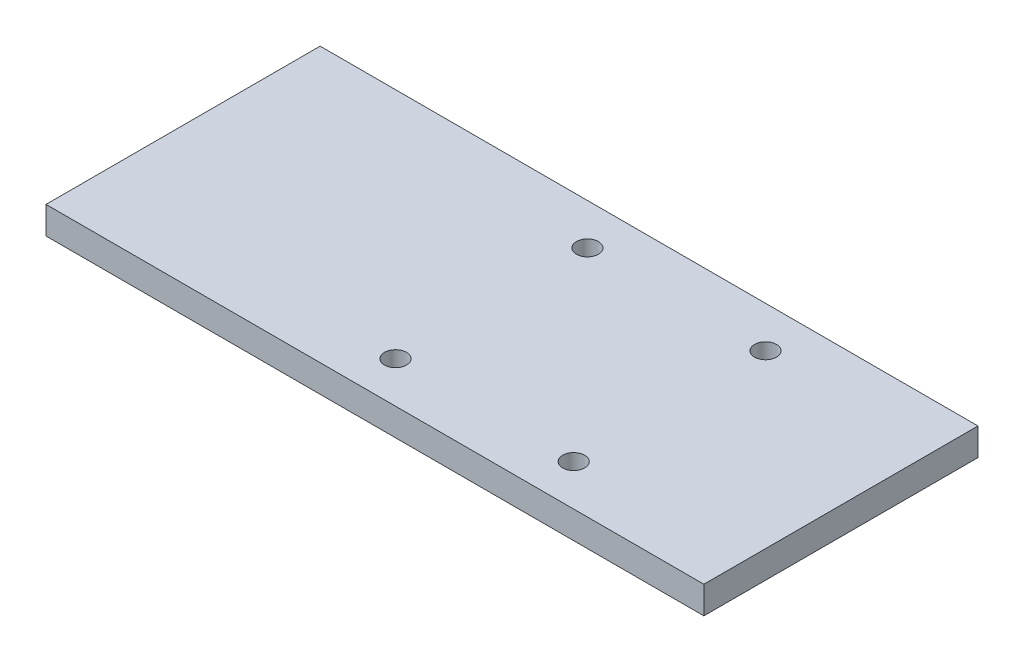
ISO-10303-21;
HEADER;
FILE_DESCRIPTION(('STEP AP214'),'2;1');
FILE_NAME('part.step','',(''),(''),'','','');
FILE_SCHEMA(('AUTOMOTIVE_DESIGN { 1 0 10303 214 1 1 1 1 }'));
ENDSEC;
DATA;
#1=APPLICATION_CONTEXT('core data for automotive mechanical design processes');
#2=APPLICATION_PROTOCOL_DEFINITION('international standard','automotive_design',2000,#1);
#3=PRODUCT_CONTEXT('',#1,'mechanical');
#4=PRODUCT('Part','Part','',(#3));
#5=PRODUCT_RELATED_PRODUCT_CATEGORY('part','',(#4));
#6=PRODUCT_DEFINITION_FORMATION('','',#4);
#7=PRODUCT_DEFINITION_CONTEXT('part definition',#1,'design');
#8=PRODUCT_DEFINITION('design','',#6,#7);
#9=PRODUCT_DEFINITION_SHAPE('','',#8);
#10=(LENGTH_UNIT() NAMED_UNIT(*) SI_UNIT(.MILLI.,.METRE.));
#11=(NAMED_UNIT(*) PLANE_ANGLE_UNIT() SI_UNIT($,.RADIAN.));
#12=(NAMED_UNIT(*) SI_UNIT($,.STERADIAN.) SOLID_ANGLE_UNIT());
#13=UNCERTAINTY_MEASURE_WITH_UNIT(LENGTH_MEASURE(1.E-05),#10,'distance_accuracy_value','');
#14=(GEOMETRIC_REPRESENTATION_CONTEXT(3) GLOBAL_UNCERTAINTY_ASSIGNED_CONTEXT((#13)) GLOBAL_UNIT_ASSIGNED_CONTEXT((#10,
#11,#12)) REPRESENTATION_CONTEXT('',''));
#15=CARTESIAN_POINT('',(0.,0.,0.));
#16=DIRECTION('',(0.,0.,1.));
#17=DIRECTION('',(1.,0.,0.));
#18=AXIS2_PLACEMENT_3D('',#15,#16,#17);
#19=CARTESIAN_POINT('',(76.2,3.175,-31.75));
#20=DIRECTION('',(0.,0.,1.));
#21=DIRECTION('',(1.,0.,0.));
#22=AXIS2_PLACEMENT_3D('',#19,#20,#21);
#23=PLANE('',#22);
#24=DIRECTION('',(0.,1.,0.));
#25=VECTOR('',#24,1.);
#26=CARTESIAN_POINT('',(-76.2,3.175,-31.75));
#27=LINE('',#26,#25);
#28=CARTESIAN_POINT('',(-76.2,-3.175,-31.75));
#29=VERTEX_POINT('',#28);
#30=CARTESIAN_POINT('',(-76.2,3.175,-31.75));
#31=VERTEX_POINT('',#30);
#32=EDGE_CURVE('E96',#29,#31,#27,.T.);
#33=ORIENTED_EDGE('',*,*,#32,.T.);
#34=DIRECTION('',(-1.,0.,0.));
#35=VECTOR('',#34,1.);
#36=CARTESIAN_POINT('',(76.2,3.175,-31.75));
#37=LINE('',#36,#35);
#38=CARTESIAN_POINT('',(76.2,3.175,-31.75));
#39=VERTEX_POINT('',#38);
#40=EDGE_CURVE('E11',#39,#31,#37,.T.);
#41=ORIENTED_EDGE('',*,*,#40,.F.);
#42=DIRECTION('',(0.,1.,0.));
#43=VECTOR('',#42,1.);
#44=CARTESIAN_POINT('',(76.2,3.175,-31.75));
#45=LINE('',#44,#43);
#46=CARTESIAN_POINT('',(76.2,-3.175,-31.75));
#47=VERTEX_POINT('',#46);
#48=EDGE_CURVE('E84',#47,#39,#45,.T.);
#49=ORIENTED_EDGE('',*,*,#48,.F.);
#50=DIRECTION('',(-1.,0.,0.));
#51=VECTOR('',#50,1.);
#52=CARTESIAN_POINT('',(76.2,-3.175,-31.75));
#53=LINE('',#52,#51);
#54=EDGE_CURVE('E92',#47,#29,#53,.T.);
#55=ORIENTED_EDGE('',*,*,#54,.T.);
#56=EDGE_LOOP('',(#33,#41,#49,#55));
#57=FACE_BOUND('',#56,.T.);
#58=ADVANCED_FACE('F33',(#57),#23,.F.);
#59=CARTESIAN_POINT('',(76.2,3.175,31.75));
#60=DIRECTION('',(0.,-1.,0.));
#61=DIRECTION('',(0.,0.,-1.));
#62=AXIS2_PLACEMENT_3D('',#59,#60,#61);
#63=PLANE('',#62);
#64=CARTESIAN_POINT('',(-4.7625,3.175,-22.225));
#65=DIRECTION('',(0.,1.,0.));
#66=DIRECTION('',(0.,0.,1.));
#67=AXIS2_PLACEMENT_3D('',#64,#65,#66);
#68=CIRCLE('',#67,2.55269999999999);
#69=CARTESIAN_POINT('',(-4.7625,3.175,-19.6723));
#70=VERTEX_POINT('',#69);
#71=EDGE_CURVE('E130',#70,#70,#68,.T.);
#72=ORIENTED_EDGE('',*,*,#71,.F.);
#73=EDGE_LOOP('',(#72));
#74=FACE_BOUND('',#73,.T.);
#75=CARTESIAN_POINT('',(36.5125,3.175,22.225));
#76=DIRECTION('',(0.,1.,0.));
#77=DIRECTION('',(0.,0.,1.));
#78=AXIS2_PLACEMENT_3D('',#75,#76,#77);
#79=CIRCLE('',#78,2.55269999999999);
#80=CARTESIAN_POINT('',(36.5125,3.175,24.7777));
#81=VERTEX_POINT('',#80);
#82=EDGE_CURVE('E124',#81,#81,#79,.T.);
#83=ORIENTED_EDGE('',*,*,#82,.F.);
#84=EDGE_LOOP('',(#83));
#85=FACE_BOUND('',#84,.T.);
#86=CARTESIAN_POINT('',(-4.76249999999999,3.175,22.225));
#87=DIRECTION('',(0.,1.,0.));
#88=DIRECTION('',(0.,0.,1.));
#89=AXIS2_PLACEMENT_3D('',#86,#87,#88);
#90=CIRCLE('',#89,2.55269999999999);
#91=CARTESIAN_POINT('',(-4.76249999999999,3.175,24.7777));
#92=VERTEX_POINT('',#91);
#93=EDGE_CURVE('E118',#92,#92,#90,.T.);
#94=ORIENTED_EDGE('',*,*,#93,.F.);
#95=EDGE_LOOP('',(#94));
#96=FACE_BOUND('',#95,.T.);
#97=CARTESIAN_POINT('',(36.5125,3.175,-22.225));
#98=DIRECTION('',(0.,1.,0.));
#99=DIRECTION('',(0.,0.,1.));
#100=AXIS2_PLACEMENT_3D('',#97,#98,#99);
#101=CIRCLE('',#100,2.55269999999999);
#102=CARTESIAN_POINT('',(36.5125,3.175,-19.6723));
#103=VERTEX_POINT('',#102);
#104=EDGE_CURVE('E112',#103,#103,#101,.T.);
#105=ORIENTED_EDGE('',*,*,#104,.F.);
#106=EDGE_LOOP('',(#105));
#107=FACE_BOUND('',#106,.T.);
#108=DIRECTION('',(0.,0.,1.));
#109=VECTOR('',#108,1.);
#110=CARTESIAN_POINT('',(-76.2,3.175,31.75));
#111=LINE('',#110,#109);
#112=CARTESIAN_POINT('',(-76.2,3.175,31.75));
#113=VERTEX_POINT('',#112);
#114=EDGE_CURVE('E88',#31,#113,#111,.T.);
#115=ORIENTED_EDGE('',*,*,#114,.T.);
#116=DIRECTION('',(-1.,0.,0.));
#117=VECTOR('',#116,1.);
#118=CARTESIAN_POINT('',(76.2,3.175,31.75));
#119=LINE('',#118,#117);
#120=CARTESIAN_POINT('',(76.2,3.175,31.75));
#121=VERTEX_POINT('',#120);
#122=EDGE_CURVE('E41',#121,#113,#119,.T.);
#123=ORIENTED_EDGE('',*,*,#122,.F.);
#124=DIRECTION('',(0.,0.,1.));
#125=VECTOR('',#124,1.);
#126=CARTESIAN_POINT('',(76.2,3.175,31.75));
#127=LINE('',#126,#125);
#128=EDGE_CURVE('E79',#39,#121,#127,.T.);
#129=ORIENTED_EDGE('',*,*,#128,.F.);
#130=ORIENTED_EDGE('',*,*,#40,.T.);
#131=EDGE_LOOP('',(#115,#123,#129,#130));
#132=FACE_BOUND('',#131,.T.);
#133=ADVANCED_FACE('F87',(#74,#85,#96,#107,#132),#63,.F.);
#134=CARTESIAN_POINT('',(76.2,3.175,31.75));
#135=DIRECTION('',(0.,0.,-1.));
#136=DIRECTION('',(-1.,0.,0.));
#137=AXIS2_PLACEMENT_3D('',#134,#135,#136);
#138=PLANE('',#137);
#139=DIRECTION('',(0.,-1.,0.));
#140=VECTOR('',#139,1.);
#141=CARTESIAN_POINT('',(-76.2,3.175,31.75));
#142=LINE('',#141,#140);
#143=CARTESIAN_POINT('',(-76.2,-3.175,31.75));
#144=VERTEX_POINT('',#143);
#145=EDGE_CURVE('E66',#113,#144,#142,.T.);
#146=ORIENTED_EDGE('',*,*,#145,.T.);
#147=DIRECTION('',(-1.,0.,0.));
#148=VECTOR('',#147,1.);
#149=CARTESIAN_POINT('',(76.2,-3.175,31.75));
#150=LINE('',#149,#148);
#151=CARTESIAN_POINT('',(76.2,-3.175,31.75));
#152=VERTEX_POINT('',#151);
#153=EDGE_CURVE('E89',#152,#144,#150,.T.);
#154=ORIENTED_EDGE('',*,*,#153,.F.);
#155=DIRECTION('',(0.,-1.,0.));
#156=VECTOR('',#155,1.);
#157=CARTESIAN_POINT('',(76.2,3.175,31.75));
#158=LINE('',#157,#156);
#159=EDGE_CURVE('E82',#121,#152,#158,.T.);
#160=ORIENTED_EDGE('',*,*,#159,.F.);
#161=ORIENTED_EDGE('',*,*,#122,.T.);
#162=EDGE_LOOP('',(#146,#154,#160,#161));
#163=FACE_BOUND('',#162,.T.);
#164=ADVANCED_FACE('F90',(#163),#138,.F.);
#165=CARTESIAN_POINT('',(76.2,-3.175,31.75));
#166=DIRECTION('',(0.,1.,0.));
#167=DIRECTION('',(0.,0.,1.));
#168=AXIS2_PLACEMENT_3D('',#165,#166,#167);
#169=PLANE('',#168);
#170=CARTESIAN_POINT('',(-4.7625,-3.175,-22.225));
#171=DIRECTION('',(0.,1.,0.));
#172=DIRECTION('',(0.,0.,1.));
#173=AXIS2_PLACEMENT_3D('',#170,#171,#172);
#174=CIRCLE('',#173,2.55269999999999);
#175=CARTESIAN_POINT('',(-4.7625,-3.175,-19.6723));
#176=VERTEX_POINT('',#175);
#177=EDGE_CURVE('E127',#176,#176,#174,.T.);
#178=ORIENTED_EDGE('',*,*,#177,.T.);
#179=EDGE_LOOP('',(#178));
#180=FACE_BOUND('',#179,.T.);
#181=CARTESIAN_POINT('',(36.5125,-3.175,22.225));
#182=DIRECTION('',(0.,1.,0.));
#183=DIRECTION('',(0.,0.,1.));
#184=AXIS2_PLACEMENT_3D('',#181,#182,#183);
#185=CIRCLE('',#184,2.55269999999999);
#186=CARTESIAN_POINT('',(36.5125,-3.175,24.7777));
#187=VERTEX_POINT('',#186);
#188=EDGE_CURVE('E121',#187,#187,#185,.T.);
#189=ORIENTED_EDGE('',*,*,#188,.T.);
#190=EDGE_LOOP('',(#189));
#191=FACE_BOUND('',#190,.T.);
#192=CARTESIAN_POINT('',(-4.76249999999999,-3.175,22.225));
#193=DIRECTION('',(0.,1.,0.));
#194=DIRECTION('',(0.,0.,1.));
#195=AXIS2_PLACEMENT_3D('',#192,#193,#194);
#196=CIRCLE('',#195,2.55269999999999);
#197=CARTESIAN_POINT('',(-4.76249999999999,-3.175,24.7777));
#198=VERTEX_POINT('',#197);
#199=EDGE_CURVE('E115',#198,#198,#196,.T.);
#200=ORIENTED_EDGE('',*,*,#199,.T.);
#201=EDGE_LOOP('',(#200));
#202=FACE_BOUND('',#201,.T.);
#203=CARTESIAN_POINT('',(36.5125,-3.175,-22.225));
#204=DIRECTION('',(0.,1.,0.));
#205=DIRECTION('',(0.,0.,1.));
#206=AXIS2_PLACEMENT_3D('',#203,#204,#205);
#207=CIRCLE('',#206,2.55269999999999);
#208=CARTESIAN_POINT('',(36.5125,-3.175,-19.6723));
#209=VERTEX_POINT('',#208);
#210=EDGE_CURVE('E99',#209,#209,#207,.T.);
#211=ORIENTED_EDGE('',*,*,#210,.T.);
#212=EDGE_LOOP('',(#211));
#213=FACE_BOUND('',#212,.T.);
#214=DIRECTION('',(0.,0.,-1.));
#215=VECTOR('',#214,1.);
#216=CARTESIAN_POINT('',(-76.2,-3.175,31.75));
#217=LINE('',#216,#215);
#218=EDGE_CURVE('E72',#144,#29,#217,.T.);
#219=ORIENTED_EDGE('',*,*,#218,.T.);
#220=ORIENTED_EDGE('',*,*,#54,.F.);
#221=DIRECTION('',(0.,0.,-1.));
#222=VECTOR('',#221,1.);
#223=CARTESIAN_POINT('',(76.2,-3.175,31.75));
#224=LINE('',#223,#222);
#225=EDGE_CURVE('E49',#152,#47,#224,.T.);
#226=ORIENTED_EDGE('',*,*,#225,.F.);
#227=ORIENTED_EDGE('',*,*,#153,.T.);
#228=EDGE_LOOP('',(#219,#220,#226,#227));
#229=FACE_BOUND('',#228,.T.);
#230=ADVANCED_FACE('F104',(#180,#191,#202,#213,#229),#169,.F.);
#231=CARTESIAN_POINT('',(76.2,0.,0.));
#232=DIRECTION('',(1.,0.,0.));
#233=DIRECTION('',(0.,0.,-1.));
#234=AXIS2_PLACEMENT_3D('',#231,#232,#233);
#235=PLANE('',#234);
#236=ORIENTED_EDGE('',*,*,#48,.T.);
#237=ORIENTED_EDGE('',*,*,#128,.T.);
#238=ORIENTED_EDGE('',*,*,#159,.T.);
#239=ORIENTED_EDGE('',*,*,#225,.T.);
#240=EDGE_LOOP('',(#236,#237,#238,#239));
#241=FACE_BOUND('',#240,.T.);
#242=ADVANCED_FACE('F80',(#241),#235,.T.);
#243=CARTESIAN_POINT('',(-76.2,0.,0.));
#244=DIRECTION('',(1.,0.,0.));
#245=DIRECTION('',(0.,0.,-1.));
#246=AXIS2_PLACEMENT_3D('',#243,#244,#245);
#247=PLANE('',#246);
#248=ORIENTED_EDGE('',*,*,#32,.F.);
#249=ORIENTED_EDGE('',*,*,#218,.F.);
#250=ORIENTED_EDGE('',*,*,#145,.F.);
#251=ORIENTED_EDGE('',*,*,#114,.F.);
#252=EDGE_LOOP('',(#248,#249,#250,#251));
#253=FACE_BOUND('',#252,.T.);
#254=ADVANCED_FACE('F107',(#253),#247,.F.);
#255=CARTESIAN_POINT('',(36.5125,3.175,-22.225));
#256=DIRECTION('',(0.,1.,0.));
#257=DIRECTION('',(0.,0.,1.));
#258=AXIS2_PLACEMENT_3D('',#255,#256,#257);
#259=CYLINDRICAL_SURFACE('',#258,2.55269999999999);
#260=ORIENTED_EDGE('',*,*,#104,.T.);
#261=EDGE_LOOP('',(#260));
#262=FACE_BOUND('',#261,.T.);
#263=ORIENTED_EDGE('',*,*,#210,.F.);
#264=EDGE_LOOP('',(#263));
#265=FACE_BOUND('',#264,.T.);
#266=ADVANCED_FACE('F145',(#262,#265),#259,.F.);
#267=CARTESIAN_POINT('',(-4.76249999999999,3.175,22.225));
#268=DIRECTION('',(0.,1.,0.));
#269=DIRECTION('',(0.,0.,1.));
#270=AXIS2_PLACEMENT_3D('',#267,#268,#269);
#271=CYLINDRICAL_SURFACE('',#270,2.55269999999999);
#272=ORIENTED_EDGE('',*,*,#93,.T.);
#273=EDGE_LOOP('',(#272));
#274=FACE_BOUND('',#273,.T.);
#275=ORIENTED_EDGE('',*,*,#199,.F.);
#276=EDGE_LOOP('',(#275));
#277=FACE_BOUND('',#276,.T.);
#278=ADVANCED_FACE('F148',(#274,#277),#271,.F.);
#279=CARTESIAN_POINT('',(36.5125,3.175,22.225));
#280=DIRECTION('',(0.,1.,0.));
#281=DIRECTION('',(0.,0.,1.));
#282=AXIS2_PLACEMENT_3D('',#279,#280,#281);
#283=CYLINDRICAL_SURFACE('',#282,2.55269999999999);
#284=ORIENTED_EDGE('',*,*,#82,.T.);
#285=EDGE_LOOP('',(#284));
#286=FACE_BOUND('',#285,.T.);
#287=ORIENTED_EDGE('',*,*,#188,.F.);
#288=EDGE_LOOP('',(#287));
#289=FACE_BOUND('',#288,.T.);
#290=ADVANCED_FACE('F200',(#286,#289),#283,.F.);
#291=CARTESIAN_POINT('',(-4.7625,3.175,-22.225));
#292=DIRECTION('',(0.,1.,0.));
#293=DIRECTION('',(0.,0.,1.));
#294=AXIS2_PLACEMENT_3D('',#291,#292,#293);
#295=CYLINDRICAL_SURFACE('',#294,2.55269999999999);
#296=ORIENTED_EDGE('',*,*,#71,.T.);
#297=EDGE_LOOP('',(#296));
#298=FACE_BOUND('',#297,.T.);
#299=ORIENTED_EDGE('',*,*,#177,.F.);
#300=EDGE_LOOP('',(#299));
#301=FACE_BOUND('',#300,.T.);
#302=ADVANCED_FACE('F134',(#298,#301),#295,.F.);
#303=CLOSED_SHELL('',(#58,#133,#164,#230,#242,#254,#266,#278,#290,#302));
#304=MANIFOLD_SOLID_BREP('B2',#303);
#305=ADVANCED_BREP_SHAPE_REPRESENTATION('',(#18,#304),#14);
#306=SHAPE_DEFINITION_REPRESENTATION(#9,#305);
ENDSEC;
END-ISO-10303-21;
